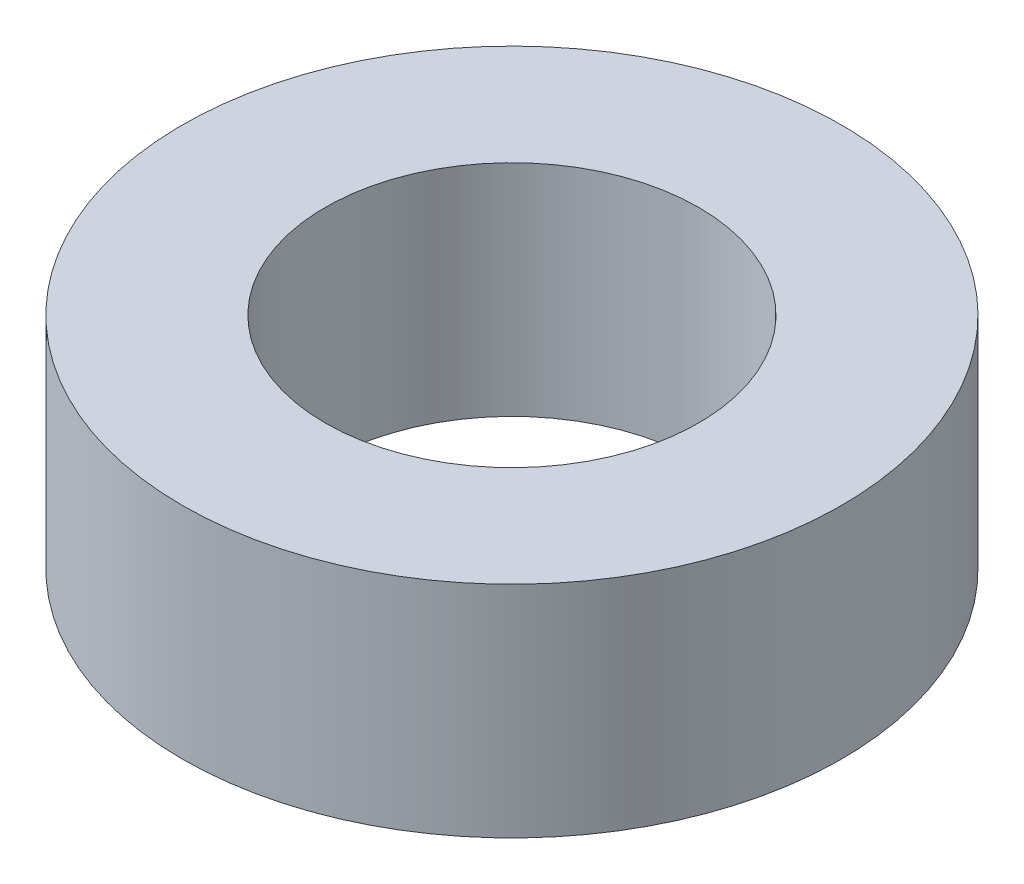
ISO-10303-21;
HEADER;
FILE_DESCRIPTION(('STEP AP214'),'2;1');
FILE_NAME('part.step','',(''),(''),'','','');
FILE_SCHEMA(('AUTOMOTIVE_DESIGN { 1 0 10303 214 1 1 1 1 }'));
ENDSEC;
DATA;
#1=APPLICATION_CONTEXT('core data for automotive mechanical design processes');
#2=APPLICATION_PROTOCOL_DEFINITION('international standard','automotive_design',2000,#1);
#3=PRODUCT_CONTEXT('',#1,'mechanical');
#4=PRODUCT('Part','Part','',(#3));
#5=PRODUCT_RELATED_PRODUCT_CATEGORY('part','',(#4));
#6=PRODUCT_DEFINITION_FORMATION('','',#4);
#7=PRODUCT_DEFINITION_CONTEXT('part definition',#1,'design');
#8=PRODUCT_DEFINITION('design','',#6,#7);
#9=PRODUCT_DEFINITION_SHAPE('','',#8);
#10=(LENGTH_UNIT() NAMED_UNIT(*) SI_UNIT(.MILLI.,.METRE.));
#11=(NAMED_UNIT(*) PLANE_ANGLE_UNIT() SI_UNIT($,.RADIAN.));
#12=(NAMED_UNIT(*) SI_UNIT($,.STERADIAN.) SOLID_ANGLE_UNIT());
#13=UNCERTAINTY_MEASURE_WITH_UNIT(LENGTH_MEASURE(1.E-05),#10,'distance_accuracy_value','');
#14=(GEOMETRIC_REPRESENTATION_CONTEXT(3) GLOBAL_UNCERTAINTY_ASSIGNED_CONTEXT((#13)) GLOBAL_UNIT_ASSIGNED_CONTEXT((#10,
#11,#12)) REPRESENTATION_CONTEXT('',''));
#15=CARTESIAN_POINT('',(0.,0.,0.));
#16=DIRECTION('',(0.,0.,1.));
#17=DIRECTION('',(1.,0.,0.));
#18=AXIS2_PLACEMENT_3D('',#15,#16,#17);
#19=CARTESIAN_POINT('',(0.,5.,0.));
#20=DIRECTION('',(0.,1.,0.));
#21=DIRECTION('',(0.,0.,1.));
#22=AXIS2_PLACEMENT_3D('',#19,#20,#21);
#23=PLANE('',#22);
#24=CARTESIAN_POINT('',(0.,5.,0.));
#25=DIRECTION('',(0.,1.,0.));
#26=DIRECTION('',(0.,0.,1.));
#27=AXIS2_PLACEMENT_3D('',#24,#25,#26);
#28=CIRCLE('',#27,15.);
#29=CARTESIAN_POINT('',(0.,5.,15.));
#30=VERTEX_POINT('',#29);
#31=EDGE_CURVE('E10',#30,#30,#28,.T.);
#32=ORIENTED_EDGE('',*,*,#31,.T.);
#33=EDGE_LOOP('',(#32));
#34=FACE_BOUND('',#33,.T.);
#35=CARTESIAN_POINT('',(0.,5.,0.));
#36=DIRECTION('',(0.,1.,0.));
#37=DIRECTION('',(0.,0.,1.));
#38=AXIS2_PLACEMENT_3D('',#35,#36,#37);
#39=CIRCLE('',#38,8.5);
#40=CARTESIAN_POINT('',(0.,5.,8.5));
#41=VERTEX_POINT('',#40);
#42=EDGE_CURVE('E42',#41,#41,#39,.T.);
#43=ORIENTED_EDGE('',*,*,#42,.F.);
#44=EDGE_LOOP('',(#43));
#45=FACE_BOUND('',#44,.T.);
#46=ADVANCED_FACE('F31',(#34,#45),#23,.T.);
#47=CARTESIAN_POINT('',(0.,-5.,0.));
#48=DIRECTION('',(0.,1.,0.));
#49=DIRECTION('',(0.,0.,1.));
#50=AXIS2_PLACEMENT_3D('',#47,#48,#49);
#51=PLANE('',#50);
#52=CARTESIAN_POINT('',(0.,-5.,0.));
#53=DIRECTION('',(0.,1.,0.));
#54=DIRECTION('',(0.,0.,1.));
#55=AXIS2_PLACEMENT_3D('',#52,#53,#54);
#56=CIRCLE('',#55,15.);
#57=CARTESIAN_POINT('',(0.,-5.,15.));
#58=VERTEX_POINT('',#57);
#59=EDGE_CURVE('E35',#58,#58,#56,.T.);
#60=ORIENTED_EDGE('',*,*,#59,.F.);
#61=EDGE_LOOP('',(#60));
#62=FACE_BOUND('',#61,.T.);
#63=CARTESIAN_POINT('',(0.,-5.,0.));
#64=DIRECTION('',(0.,1.,0.));
#65=DIRECTION('',(0.,0.,1.));
#66=AXIS2_PLACEMENT_3D('',#63,#64,#65);
#67=CIRCLE('',#66,8.5);
#68=CARTESIAN_POINT('',(0.,-5.,8.5));
#69=VERTEX_POINT('',#68);
#70=EDGE_CURVE('E44',#69,#69,#67,.T.);
#71=ORIENTED_EDGE('',*,*,#70,.T.);
#72=EDGE_LOOP('',(#71));
#73=FACE_BOUND('',#72,.T.);
#74=ADVANCED_FACE('F54',(#62,#73),#51,.F.);
#75=CARTESIAN_POINT('',(0.,5.,0.));
#76=DIRECTION('',(0.,-1.,0.));
#77=DIRECTION('',(0.,0.,-1.));
#78=AXIS2_PLACEMENT_3D('',#75,#76,#77);
#79=CYLINDRICAL_SURFACE('',#78,15.);
#80=ORIENTED_EDGE('',*,*,#31,.F.);
#81=EDGE_LOOP('',(#80));
#82=FACE_BOUND('',#81,.T.);
#83=ORIENTED_EDGE('',*,*,#59,.T.);
#84=EDGE_LOOP('',(#83));
#85=FACE_BOUND('',#84,.T.);
#86=ADVANCED_FACE('F33',(#82,#85),#79,.T.);
#87=CARTESIAN_POINT('',(0.,5.,0.));
#88=DIRECTION('',(0.,-1.,0.));
#89=DIRECTION('',(0.,0.,-1.));
#90=AXIS2_PLACEMENT_3D('',#87,#88,#89);
#91=CYLINDRICAL_SURFACE('',#90,8.5);
#92=ORIENTED_EDGE('',*,*,#42,.T.);
#93=EDGE_LOOP('',(#92));
#94=FACE_BOUND('',#93,.T.);
#95=ORIENTED_EDGE('',*,*,#70,.F.);
#96=EDGE_LOOP('',(#95));
#97=FACE_BOUND('',#96,.T.);
#98=ADVANCED_FACE('F50',(#94,#97),#91,.F.);
#99=CLOSED_SHELL('',(#46,#74,#86,#98));
#100=MANIFOLD_SOLID_BREP('B2',#99);
#101=ADVANCED_BREP_SHAPE_REPRESENTATION('',(#18,#100),#14);
#102=SHAPE_DEFINITION_REPRESENTATION(#9,#101);
ENDSEC;
END-ISO-10303-21;
